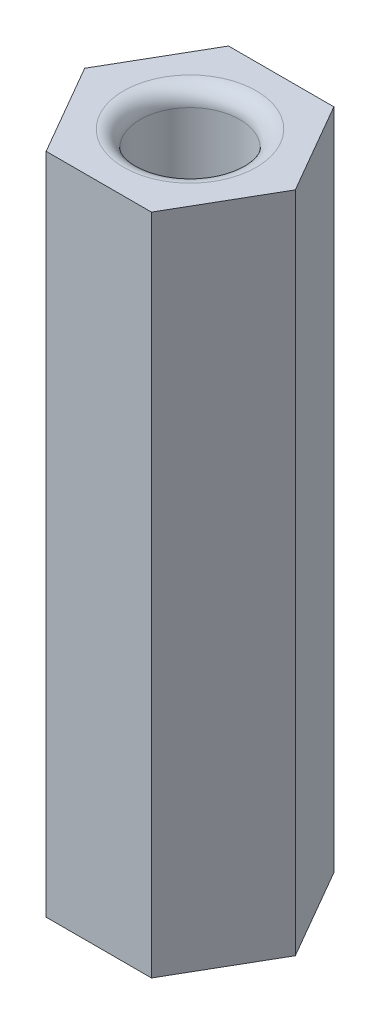
ISO-10303-21;
HEADER;
FILE_DESCRIPTION(('STEP AP214'),'2;1');
FILE_NAME('part.step','',(''),(''),'','','');
FILE_SCHEMA(('AUTOMOTIVE_DESIGN { 1 0 10303 214 1 1 1 1 }'));
ENDSEC;
DATA;
#1=APPLICATION_CONTEXT('core data for automotive mechanical design processes');
#2=APPLICATION_PROTOCOL_DEFINITION('international standard','automotive_design',2000,#1);
#3=PRODUCT_CONTEXT('',#1,'mechanical');
#4=PRODUCT('Part','Part','',(#3));
#5=PRODUCT_RELATED_PRODUCT_CATEGORY('part','',(#4));
#6=PRODUCT_DEFINITION_FORMATION('','',#4);
#7=PRODUCT_DEFINITION_CONTEXT('part definition',#1,'design');
#8=PRODUCT_DEFINITION('design','',#6,#7);
#9=PRODUCT_DEFINITION_SHAPE('','',#8);
#10=(LENGTH_UNIT() NAMED_UNIT(*) SI_UNIT(.MILLI.,.METRE.));
#11=(NAMED_UNIT(*) PLANE_ANGLE_UNIT() SI_UNIT($,.RADIAN.));
#12=(NAMED_UNIT(*) SI_UNIT($,.STERADIAN.) SOLID_ANGLE_UNIT());
#13=UNCERTAINTY_MEASURE_WITH_UNIT(LENGTH_MEASURE(1.E-05),#10,'distance_accuracy_value','');
#14=(GEOMETRIC_REPRESENTATION_CONTEXT(3) GLOBAL_UNCERTAINTY_ASSIGNED_CONTEXT((#13)) GLOBAL_UNIT_ASSIGNED_CONTEXT((#10,
#11,#12)) REPRESENTATION_CONTEXT('',''));
#15=CARTESIAN_POINT('',(0.,0.,0.));
#16=DIRECTION('',(0.,0.,1.));
#17=DIRECTION('',(1.,0.,0.));
#18=AXIS2_PLACEMENT_3D('',#15,#16,#17);
#19=CARTESIAN_POINT('',(0.,20.,0.));
#20=DIRECTION('',(0.,1.,0.));
#21=DIRECTION('',(0.,0.,1.));
#22=AXIS2_PLACEMENT_3D('',#19,#20,#21);
#23=PLANE('',#22);
#24=CARTESIAN_POINT('',(0.,20.,0.));
#25=DIRECTION('',(0.,1.,0.));
#26=DIRECTION('',(0.,0.,1.));
#27=AXIS2_PLACEMENT_3D('',#24,#25,#26);
#28=CIRCLE('',#27,2.);
#29=CARTESIAN_POINT('',(0.,20.,2.));
#30=VERTEX_POINT('',#29);
#31=EDGE_CURVE('E11',#30,#30,#28,.F.);
#32=ORIENTED_EDGE('',*,*,#31,.T.);
#33=EDGE_LOOP('',(#32));
#34=FACE_BOUND('',#33,.T.);
#35=DIRECTION('',(-0.5,0.,0.866025403784439));
#36=VECTOR('',#35,1.);
#37=CARTESIAN_POINT('',(-1.58771324027147,20.,-2.75));
#38=LINE('',#37,#36);
#39=CARTESIAN_POINT('',(-1.58771324027147,20.,-2.75));
#40=VERTEX_POINT('',#39);
#41=CARTESIAN_POINT('',(-3.17542648054294,20.,0.));
#42=VERTEX_POINT('',#41);
#43=EDGE_CURVE('E128',#40,#42,#38,.T.);
#44=ORIENTED_EDGE('',*,*,#43,.T.);
#45=DIRECTION('',(0.5,0.,0.866025403784439));
#46=VECTOR('',#45,1.);
#47=CARTESIAN_POINT('',(-3.17542648054294,20.,0.));
#48=LINE('',#47,#46);
#49=CARTESIAN_POINT('',(-1.58771324027147,20.,2.75));
#50=VERTEX_POINT('',#49);
#51=EDGE_CURVE('E88',#42,#50,#48,.T.);
#52=ORIENTED_EDGE('',*,*,#51,.T.);
#53=DIRECTION('',(1.,0.,0.));
#54=VECTOR('',#53,1.);
#55=CARTESIAN_POINT('',(-1.58771324027147,20.,2.75));
#56=LINE('',#55,#54);
#57=CARTESIAN_POINT('',(1.58771324027147,20.,2.75));
#58=VERTEX_POINT('',#57);
#59=EDGE_CURVE('E100',#50,#58,#56,.T.);
#60=ORIENTED_EDGE('',*,*,#59,.T.);
#61=DIRECTION('',(0.5,0.,-0.866025403784439));
#62=VECTOR('',#61,1.);
#63=CARTESIAN_POINT('',(1.58771324027147,20.,2.75));
#64=LINE('',#63,#62);
#65=CARTESIAN_POINT('',(3.17542648054294,20.,0.));
#66=VERTEX_POINT('',#65);
#67=EDGE_CURVE('E95',#58,#66,#64,.T.);
#68=ORIENTED_EDGE('',*,*,#67,.T.);
#69=DIRECTION('',(-0.5,0.,-0.866025403784439));
#70=VECTOR('',#69,1.);
#71=CARTESIAN_POINT('',(3.17542648054294,20.,0.));
#72=LINE('',#71,#70);
#73=CARTESIAN_POINT('',(1.58771324027147,20.,-2.75));
#74=VERTEX_POINT('',#73);
#75=EDGE_CURVE('E98',#66,#74,#72,.T.);
#76=ORIENTED_EDGE('',*,*,#75,.T.);
#77=DIRECTION('',(-1.,0.,0.));
#78=VECTOR('',#77,1.);
#79=CARTESIAN_POINT('',(1.58771324027147,20.,-2.75));
#80=LINE('',#79,#78);
#81=EDGE_CURVE('E50',#74,#40,#80,.T.);
#82=ORIENTED_EDGE('',*,*,#81,.T.);
#83=EDGE_LOOP('',(#44,#52,#60,#68,#76,#82));
#84=FACE_BOUND('',#83,.T.);
#85=ADVANCED_FACE('F33',(#34,#84),#23,.T.);
#86=CARTESIAN_POINT('',(0.,0.,0.));
#87=DIRECTION('',(0.,1.,0.));
#88=DIRECTION('',(0.,0.,1.));
#89=AXIS2_PLACEMENT_3D('',#86,#87,#88);
#90=PLANE('',#89);
#91=CARTESIAN_POINT('',(0.,0.,0.));
#92=DIRECTION('',(0.,1.,0.));
#93=DIRECTION('',(0.,0.,1.));
#94=AXIS2_PLACEMENT_3D('',#91,#92,#93);
#95=CIRCLE('',#94,2.);
#96=CARTESIAN_POINT('',(0.,0.,2.));
#97=VERTEX_POINT('',#96);
#98=EDGE_CURVE('E137',#97,#97,#95,.T.);
#99=ORIENTED_EDGE('',*,*,#98,.T.);
#100=EDGE_LOOP('',(#99));
#101=FACE_BOUND('',#100,.T.);
#102=DIRECTION('',(-0.5,0.,0.866025403784439));
#103=VECTOR('',#102,1.);
#104=CARTESIAN_POINT('',(-1.58771324027147,0.,-2.75));
#105=LINE('',#104,#103);
#106=CARTESIAN_POINT('',(-1.58771324027147,0.,-2.75));
#107=VERTEX_POINT('',#106);
#108=CARTESIAN_POINT('',(-3.17542648054294,0.,0.));
#109=VERTEX_POINT('',#108);
#110=EDGE_CURVE('E118',#107,#109,#105,.T.);
#111=ORIENTED_EDGE('',*,*,#110,.F.);
#112=DIRECTION('',(-1.,0.,0.));
#113=VECTOR('',#112,1.);
#114=CARTESIAN_POINT('',(1.58771324027147,0.,-2.75));
#115=LINE('',#114,#113);
#116=CARTESIAN_POINT('',(1.58771324027147,0.,-2.75));
#117=VERTEX_POINT('',#116);
#118=EDGE_CURVE('E79',#117,#107,#115,.T.);
#119=ORIENTED_EDGE('',*,*,#118,.F.);
#120=DIRECTION('',(-0.5,0.,-0.866025403784439));
#121=VECTOR('',#120,1.);
#122=CARTESIAN_POINT('',(3.17542648054294,0.,0.));
#123=LINE('',#122,#121);
#124=CARTESIAN_POINT('',(3.17542648054294,0.,0.));
#125=VERTEX_POINT('',#124);
#126=EDGE_CURVE('E73',#125,#117,#123,.T.);
#127=ORIENTED_EDGE('',*,*,#126,.F.);
#128=DIRECTION('',(0.5,0.,-0.866025403784439));
#129=VECTOR('',#128,1.);
#130=CARTESIAN_POINT('',(1.58771324027147,0.,2.75));
#131=LINE('',#130,#129);
#132=CARTESIAN_POINT('',(1.58771324027147,0.,2.75));
#133=VERTEX_POINT('',#132);
#134=EDGE_CURVE('E108',#133,#125,#131,.T.);
#135=ORIENTED_EDGE('',*,*,#134,.F.);
#136=DIRECTION('',(1.,0.,0.));
#137=VECTOR('',#136,1.);
#138=CARTESIAN_POINT('',(-1.58771324027147,0.,2.75));
#139=LINE('',#138,#137);
#140=CARTESIAN_POINT('',(-1.58771324027147,0.,2.75));
#141=VERTEX_POINT('',#140);
#142=EDGE_CURVE('E123',#141,#133,#139,.T.);
#143=ORIENTED_EDGE('',*,*,#142,.F.);
#144=DIRECTION('',(0.5,0.,0.866025403784439));
#145=VECTOR('',#144,1.);
#146=CARTESIAN_POINT('',(-3.17542648054294,0.,0.));
#147=LINE('',#146,#145);
#148=EDGE_CURVE('E121',#109,#141,#147,.T.);
#149=ORIENTED_EDGE('',*,*,#148,.F.);
#150=EDGE_LOOP('',(#111,#119,#127,#135,#143,#149));
#151=FACE_BOUND('',#150,.T.);
#152=ADVANCED_FACE('F153',(#101,#151),#90,.F.);
#153=CARTESIAN_POINT('',(-1.58771324027147,20.,-2.75));
#154=DIRECTION('',(0.866025403784439,0.,0.5));
#155=DIRECTION('',(0.5,0.,-0.866025403784439));
#156=AXIS2_PLACEMENT_3D('',#153,#154,#155);
#157=PLANE('',#156);
#158=ORIENTED_EDGE('',*,*,#110,.T.);
#159=DIRECTION('',(0.,-1.,0.));
#160=VECTOR('',#159,1.);
#161=CARTESIAN_POINT('',(-3.17542648054294,20.,0.));
#162=LINE('',#161,#160);
#163=EDGE_CURVE('E135',#42,#109,#162,.T.);
#164=ORIENTED_EDGE('',*,*,#163,.F.);
#165=ORIENTED_EDGE('',*,*,#43,.F.);
#166=DIRECTION('',(0.,-1.,0.));
#167=VECTOR('',#166,1.);
#168=CARTESIAN_POINT('',(-1.58771324027147,20.,-2.75));
#169=LINE('',#168,#167);
#170=EDGE_CURVE('E114',#40,#107,#169,.T.);
#171=ORIENTED_EDGE('',*,*,#170,.T.);
#172=EDGE_LOOP('',(#158,#164,#165,#171));
#173=FACE_BOUND('',#172,.T.);
#174=ADVANCED_FACE('F156',(#173),#157,.F.);
#175=CARTESIAN_POINT('',(-3.17542648054294,20.,0.));
#176=DIRECTION('',(0.866025403784438,0.,-0.5));
#177=DIRECTION('',(-0.5,0.,-0.866025403784439));
#178=AXIS2_PLACEMENT_3D('',#175,#176,#177);
#179=PLANE('',#178);
#180=ORIENTED_EDGE('',*,*,#148,.T.);
#181=DIRECTION('',(0.,-1.,0.));
#182=VECTOR('',#181,1.);
#183=CARTESIAN_POINT('',(-1.58771324027147,20.,2.75));
#184=LINE('',#183,#182);
#185=EDGE_CURVE('E132',#50,#141,#184,.T.);
#186=ORIENTED_EDGE('',*,*,#185,.F.);
#187=ORIENTED_EDGE('',*,*,#51,.F.);
#188=ORIENTED_EDGE('',*,*,#163,.T.);
#189=EDGE_LOOP('',(#180,#186,#187,#188));
#190=FACE_BOUND('',#189,.T.);
#191=ADVANCED_FACE('F232',(#190),#179,.F.);
#192=CARTESIAN_POINT('',(-1.58771324027147,20.,2.75));
#193=DIRECTION('',(0.,0.,-1.));
#194=DIRECTION('',(-1.,0.,0.));
#195=AXIS2_PLACEMENT_3D('',#192,#193,#194);
#196=PLANE('',#195);
#197=ORIENTED_EDGE('',*,*,#142,.T.);
#198=DIRECTION('',(0.,-1.,0.));
#199=VECTOR('',#198,1.);
#200=CARTESIAN_POINT('',(1.58771324027147,20.,2.75));
#201=LINE('',#200,#199);
#202=EDGE_CURVE('E109',#58,#133,#201,.T.);
#203=ORIENTED_EDGE('',*,*,#202,.F.);
#204=ORIENTED_EDGE('',*,*,#59,.F.);
#205=ORIENTED_EDGE('',*,*,#185,.T.);
#206=EDGE_LOOP('',(#197,#203,#204,#205));
#207=FACE_BOUND('',#206,.T.);
#208=ADVANCED_FACE('F223',(#207),#196,.F.);
#209=CARTESIAN_POINT('',(1.58771324027147,20.,2.75));
#210=DIRECTION('',(-0.866025403784439,0.,-0.5));
#211=DIRECTION('',(-0.5,0.,0.866025403784439));
#212=AXIS2_PLACEMENT_3D('',#209,#210,#211);
#213=PLANE('',#212);
#214=ORIENTED_EDGE('',*,*,#134,.T.);
#215=DIRECTION('',(0.,-1.,0.));
#216=VECTOR('',#215,1.);
#217=CARTESIAN_POINT('',(3.17542648054294,20.,0.));
#218=LINE('',#217,#216);
#219=EDGE_CURVE('E105',#66,#125,#218,.T.);
#220=ORIENTED_EDGE('',*,*,#219,.F.);
#221=ORIENTED_EDGE('',*,*,#67,.F.);
#222=ORIENTED_EDGE('',*,*,#202,.T.);
#223=EDGE_LOOP('',(#214,#220,#221,#222));
#224=FACE_BOUND('',#223,.T.);
#225=ADVANCED_FACE('F106',(#224),#213,.F.);
#226=CARTESIAN_POINT('',(3.17542648054294,20.,0.));
#227=DIRECTION('',(-0.866025403784439,0.,0.5));
#228=DIRECTION('',(0.5,0.,0.866025403784439));
#229=AXIS2_PLACEMENT_3D('',#226,#227,#228);
#230=PLANE('',#229);
#231=ORIENTED_EDGE('',*,*,#126,.T.);
#232=DIRECTION('',(0.,-1.,0.));
#233=VECTOR('',#232,1.);
#234=CARTESIAN_POINT('',(1.58771324027147,20.,-2.75));
#235=LINE('',#234,#233);
#236=EDGE_CURVE('E110',#74,#117,#235,.T.);
#237=ORIENTED_EDGE('',*,*,#236,.F.);
#238=ORIENTED_EDGE('',*,*,#75,.F.);
#239=ORIENTED_EDGE('',*,*,#219,.T.);
#240=EDGE_LOOP('',(#231,#237,#238,#239));
#241=FACE_BOUND('',#240,.T.);
#242=ADVANCED_FACE('F112',(#241),#230,.F.);
#243=CARTESIAN_POINT('',(1.58771324027147,20.,-2.75));
#244=DIRECTION('',(0.,0.,1.));
#245=DIRECTION('',(1.,0.,0.));
#246=AXIS2_PLACEMENT_3D('',#243,#244,#245);
#247=PLANE('',#246);
#248=ORIENTED_EDGE('',*,*,#118,.T.);
#249=ORIENTED_EDGE('',*,*,#170,.F.);
#250=ORIENTED_EDGE('',*,*,#81,.F.);
#251=ORIENTED_EDGE('',*,*,#236,.T.);
#252=EDGE_LOOP('',(#248,#249,#250,#251));
#253=FACE_BOUND('',#252,.T.);
#254=ADVANCED_FACE('F163',(#253),#247,.F.);
#255=CARTESIAN_POINT('',(0.,20.,0.));
#256=DIRECTION('',(0.,-1.,0.));
#257=DIRECTION('',(0.,0.,-1.));
#258=AXIS2_PLACEMENT_3D('',#255,#256,#257);
#259=CYLINDRICAL_SURFACE('',#258,1.5);
#260=CARTESIAN_POINT('',(0.,0.5,0.));
#261=DIRECTION('',(0.,1.,0.));
#262=DIRECTION('',(0.,0.,1.));
#263=AXIS2_PLACEMENT_3D('',#260,#261,#262);
#264=CIRCLE('',#263,1.5);
#265=CARTESIAN_POINT('',(0.,0.5,1.5));
#266=VERTEX_POINT('',#265);
#267=EDGE_CURVE('E42',#266,#266,#264,.F.);
#268=ORIENTED_EDGE('',*,*,#267,.T.);
#269=EDGE_LOOP('',(#268));
#270=FACE_BOUND('',#269,.T.);
#271=CARTESIAN_POINT('',(0.,19.5,0.));
#272=DIRECTION('',(0.,1.,0.));
#273=DIRECTION('',(0.,0.,1.));
#274=AXIS2_PLACEMENT_3D('',#271,#272,#273);
#275=CIRCLE('',#274,1.5);
#276=CARTESIAN_POINT('',(0.,19.5,1.5));
#277=VERTEX_POINT('',#276);
#278=EDGE_CURVE('E140',#277,#277,#275,.T.);
#279=ORIENTED_EDGE('',*,*,#278,.T.);
#280=EDGE_LOOP('',(#279));
#281=FACE_BOUND('',#280,.T.);
#282=ADVANCED_FACE('F145',(#270,#281),#259,.F.);
#283=CARTESIAN_POINT('',(0.,0.5,0.));
#284=DIRECTION('',(0.,1.,0.));
#285=DIRECTION('',(0.,0.,1.));
#286=AXIS2_PLACEMENT_3D('',#283,#284,#285);
#287=TOROIDAL_SURFACE('',#286,2.,0.5);
#288=ORIENTED_EDGE('',*,*,#267,.F.);
#289=EDGE_LOOP('',(#288));
#290=FACE_BOUND('',#289,.T.);
#291=ORIENTED_EDGE('',*,*,#98,.F.);
#292=EDGE_LOOP('',(#291));
#293=FACE_BOUND('',#292,.T.);
#294=ADVANCED_FACE('F148',(#290,#293),#287,.T.);
#295=CARTESIAN_POINT('',(0.,19.5,0.));
#296=DIRECTION('',(0.,1.,0.));
#297=DIRECTION('',(0.,0.,1.));
#298=AXIS2_PLACEMENT_3D('',#295,#296,#297);
#299=TOROIDAL_SURFACE('',#298,2.,0.5);
#300=ORIENTED_EDGE('',*,*,#31,.F.);
#301=EDGE_LOOP('',(#300));
#302=FACE_BOUND('',#301,.T.);
#303=ORIENTED_EDGE('',*,*,#278,.F.);
#304=EDGE_LOOP('',(#303));
#305=FACE_BOUND('',#304,.T.);
#306=ADVANCED_FACE('F35',(#302,#305),#299,.T.);
#307=CLOSED_SHELL('',(#85,#152,#174,#191,#208,#225,#242,#254,#282,#294,#306));
#308=MANIFOLD_SOLID_BREP('B2',#307);
#309=ADVANCED_BREP_SHAPE_REPRESENTATION('',(#18,#308),#14);
#310=SHAPE_DEFINITION_REPRESENTATION(#9,#309);
ENDSEC;
END-ISO-10303-21;
